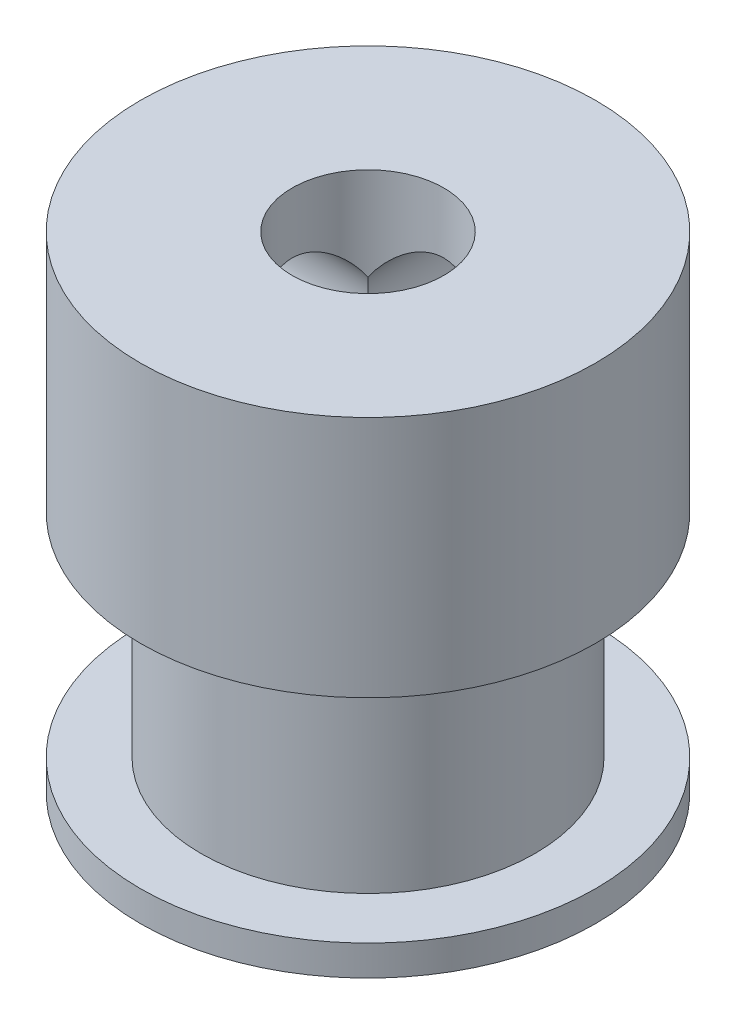
ISO-10303-21;
HEADER;
FILE_DESCRIPTION(('STEP AP214'),'2;1');
FILE_NAME('part.step','',(''),(''),'','','');
FILE_SCHEMA(('AUTOMOTIVE_DESIGN { 1 0 10303 214 1 1 1 1 }'));
ENDSEC;
DATA;
#1=APPLICATION_CONTEXT('core data for automotive mechanical design processes');
#2=APPLICATION_PROTOCOL_DEFINITION('international standard','automotive_design',2000,#1);
#3=PRODUCT_CONTEXT('',#1,'mechanical');
#4=PRODUCT('Part','Part','',(#3));
#5=PRODUCT_RELATED_PRODUCT_CATEGORY('part','',(#4));
#6=PRODUCT_DEFINITION_FORMATION('','',#4);
#7=PRODUCT_DEFINITION_CONTEXT('part definition',#1,'design');
#8=PRODUCT_DEFINITION('design','',#6,#7);
#9=PRODUCT_DEFINITION_SHAPE('','',#8);
#10=(LENGTH_UNIT() NAMED_UNIT(*) SI_UNIT(.MILLI.,.METRE.));
#11=(NAMED_UNIT(*) PLANE_ANGLE_UNIT() SI_UNIT($,.RADIAN.));
#12=(NAMED_UNIT(*) SI_UNIT($,.STERADIAN.) SOLID_ANGLE_UNIT());
#13=UNCERTAINTY_MEASURE_WITH_UNIT(LENGTH_MEASURE(1.E-05),#10,'distance_accuracy_value','');
#14=(GEOMETRIC_REPRESENTATION_CONTEXT(3) GLOBAL_UNCERTAINTY_ASSIGNED_CONTEXT((#13)) GLOBAL_UNIT_ASSIGNED_CONTEXT((#10,
#11,#12)) REPRESENTATION_CONTEXT('',''));
#15=CARTESIAN_POINT('',(0.,0.,0.));
#16=DIRECTION('',(0.,0.,1.));
#17=DIRECTION('',(1.,0.,0.));
#18=AXIS2_PLACEMENT_3D('',#15,#16,#17);
#19=CARTESIAN_POINT('',(0.,16.,0.));
#20=DIRECTION('',(0.,-1.,0.));
#21=DIRECTION('',(0.,0.,-1.));
#22=AXIS2_PLACEMENT_3D('',#19,#20,#21);
#23=CYLINDRICAL_SURFACE('',#22,7.5);
#24=CARTESIAN_POINT('',(0.,0.,0.));
#25=DIRECTION('',(0.,1.,0.));
#26=DIRECTION('',(0.,0.,1.));
#27=AXIS2_PLACEMENT_3D('',#24,#25,#26);
#28=CIRCLE('',#27,7.5);
#29=CARTESIAN_POINT('',(0.,0.,7.5));
#30=VERTEX_POINT('',#29);
#31=EDGE_CURVE('E73',#30,#30,#28,.T.);
#32=ORIENTED_EDGE('',*,*,#31,.T.);
#33=EDGE_LOOP('',(#32));
#34=FACE_BOUND('',#33,.T.);
#35=CARTESIAN_POINT('',(0.,1.,0.));
#36=DIRECTION('',(0.,-1.,0.));
#37=DIRECTION('',(0.,0.,-1.));
#38=AXIS2_PLACEMENT_3D('',#35,#36,#37);
#39=CIRCLE('',#38,7.5);
#40=CARTESIAN_POINT('',(0.,1.,-7.5));
#41=VERTEX_POINT('',#40);
#42=EDGE_CURVE('E103',#41,#41,#39,.T.);
#43=ORIENTED_EDGE('',*,*,#42,.T.);
#44=EDGE_LOOP('',(#43));
#45=FACE_BOUND('',#44,.T.);
#46=ADVANCED_FACE('F33',(#34,#45),#23,.T.);
#47=CARTESIAN_POINT('',(0.,0.,0.));
#48=DIRECTION('',(0.,1.,0.));
#49=DIRECTION('',(0.,0.,1.));
#50=AXIS2_PLACEMENT_3D('',#47,#48,#49);
#51=PLANE('',#50);
#52=CARTESIAN_POINT('',(0.,0.,0.));
#53=DIRECTION('',(0.,1.,0.));
#54=DIRECTION('',(0.,0.,1.));
#55=AXIS2_PLACEMENT_3D('',#52,#53,#54);
#56=CIRCLE('',#55,2.5);
#57=CARTESIAN_POINT('',(0.,0.,2.5));
#58=VERTEX_POINT('',#57);
#59=EDGE_CURVE('E89',#58,#58,#56,.T.);
#60=ORIENTED_EDGE('',*,*,#59,.T.);
#61=EDGE_LOOP('',(#60));
#62=FACE_BOUND('',#61,.T.);
#63=ORIENTED_EDGE('',*,*,#31,.F.);
#64=EDGE_LOOP('',(#63));
#65=FACE_BOUND('',#64,.T.);
#66=ADVANCED_FACE('F113',(#62,#65),#51,.F.);
#67=CARTESIAN_POINT('',(0.,1.,7.5));
#68=DIRECTION('',(0.,1.,0.));
#69=DIRECTION('',(0.,0.,1.));
#70=AXIS2_PLACEMENT_3D('',#67,#68,#69);
#71=PLANE('',#70);
#72=CARTESIAN_POINT('',(0.,1.,0.));
#73=DIRECTION('',(0.,-1.,0.));
#74=DIRECTION('',(0.,0.,-1.));
#75=AXIS2_PLACEMENT_3D('',#72,#73,#74);
#76=CIRCLE('',#75,5.5);
#77=CARTESIAN_POINT('',(0.,1.,-5.5));
#78=VERTEX_POINT('',#77);
#79=EDGE_CURVE('E100',#78,#78,#76,.T.);
#80=ORIENTED_EDGE('',*,*,#79,.T.);
#81=EDGE_LOOP('',(#80));
#82=FACE_BOUND('',#81,.T.);
#83=ORIENTED_EDGE('',*,*,#42,.F.);
#84=EDGE_LOOP('',(#83));
#85=FACE_BOUND('',#84,.T.);
#86=ADVANCED_FACE('F115',(#82,#85),#71,.T.);
#87=CARTESIAN_POINT('',(0.,0.,0.));
#88=DIRECTION('',(0.,-1.,0.));
#89=DIRECTION('',(0.,0.,-1.));
#90=AXIS2_PLACEMENT_3D('',#87,#88,#89);
#91=CYLINDRICAL_SURFACE('',#90,5.5);
#92=CARTESIAN_POINT('',(0.,8.,0.));
#93=DIRECTION('',(0.,-1.,0.));
#94=DIRECTION('',(0.,0.,-1.));
#95=AXIS2_PLACEMENT_3D('',#92,#93,#94);
#96=CIRCLE('',#95,5.5);
#97=CARTESIAN_POINT('',(0.,8.,-5.5));
#98=VERTEX_POINT('',#97);
#99=EDGE_CURVE('E97',#98,#98,#96,.T.);
#100=ORIENTED_EDGE('',*,*,#99,.T.);
#101=EDGE_LOOP('',(#100));
#102=FACE_BOUND('',#101,.T.);
#103=ORIENTED_EDGE('',*,*,#79,.F.);
#104=EDGE_LOOP('',(#103));
#105=FACE_BOUND('',#104,.T.);
#106=ADVANCED_FACE('F121',(#102,#105),#91,.T.);
#107=CARTESIAN_POINT('',(0.,8.,7.5));
#108=DIRECTION('',(0.,-1.,0.));
#109=DIRECTION('',(0.,0.,-1.));
#110=AXIS2_PLACEMENT_3D('',#107,#108,#109);
#111=PLANE('',#110);
#112=CARTESIAN_POINT('',(0.,8.,0.));
#113=DIRECTION('',(0.,-1.,0.));
#114=DIRECTION('',(0.,0.,-1.));
#115=AXIS2_PLACEMENT_3D('',#112,#113,#114);
#116=CIRCLE('',#115,7.5);
#117=CARTESIAN_POINT('',(0.,8.,-7.5));
#118=VERTEX_POINT('',#117);
#119=EDGE_CURVE('E92',#118,#118,#116,.T.);
#120=ORIENTED_EDGE('',*,*,#119,.T.);
#121=EDGE_LOOP('',(#120));
#122=FACE_BOUND('',#121,.T.);
#123=ORIENTED_EDGE('',*,*,#99,.F.);
#124=EDGE_LOOP('',(#123));
#125=FACE_BOUND('',#124,.T.);
#126=ADVANCED_FACE('F128',(#122,#125),#111,.T.);
#127=CARTESIAN_POINT('',(0.,16.,0.));
#128=DIRECTION('',(0.,1.,0.));
#129=DIRECTION('',(0.,0.,1.));
#130=AXIS2_PLACEMENT_3D('',#127,#128,#129);
#131=PLANE('',#130);
#132=CARTESIAN_POINT('',(0.,16.,0.));
#133=DIRECTION('',(0.,1.,0.));
#134=DIRECTION('',(0.,0.,1.));
#135=AXIS2_PLACEMENT_3D('',#132,#133,#134);
#136=CIRCLE('',#135,2.5);
#137=CARTESIAN_POINT('',(0.,16.,2.5));
#138=VERTEX_POINT('',#137);
#139=EDGE_CURVE('E63',#138,#138,#136,.T.);
#140=ORIENTED_EDGE('',*,*,#139,.F.);
#141=EDGE_LOOP('',(#140));
#142=FACE_BOUND('',#141,.T.);
#143=CARTESIAN_POINT('',(0.,16.,0.));
#144=DIRECTION('',(0.,1.,0.));
#145=DIRECTION('',(0.,0.,1.));
#146=AXIS2_PLACEMENT_3D('',#143,#144,#145);
#147=CIRCLE('',#146,7.5);
#148=CARTESIAN_POINT('',(0.,16.,7.5));
#149=VERTEX_POINT('',#148);
#150=EDGE_CURVE('E41',#149,#149,#147,.T.);
#151=ORIENTED_EDGE('',*,*,#150,.T.);
#152=EDGE_LOOP('',(#151));
#153=FACE_BOUND('',#152,.T.);
#154=ADVANCED_FACE('F126',(#142,#153),#131,.T.);
#155=CARTESIAN_POINT('',(-7.50000000000003,10.,0.));
#156=CARTESIAN_POINT('',(-7.49999833810164,10.0000026169349,-0.110254555832828));
#157=CARTESIAN_POINT('',(-7.49754486162152,10.0091476141897,-0.220537160221813));
#158=CARTESIAN_POINT('',(-7.48799573621659,10.0454212307387,-0.437925451354436));
#159=CARTESIAN_POINT('',(-7.48089785332586,10.0725585044261,-0.545029583319059));
#160=CARTESIAN_POINT('',(-7.46284333252791,10.143871666864,-0.752891589045285));
#161=CARTESIAN_POINT('',(-7.45189167130376,10.188025587666,-0.853657451015257));
#162=CARTESIAN_POINT('',(-7.42728699151678,10.2920372426666,-1.04635368639263));
#163=CARTESIAN_POINT('',(-7.4136337929518,10.3518960233593,-1.1382834704496));
#164=CARTESIAN_POINT('',(-7.38474614901995,10.4870835164134,-1.31282950373999));
#165=CARTESIAN_POINT('',(-7.36948467678682,10.5627086680083,-1.39521168986276));
#166=CARTESIAN_POINT('',(-7.33927409679592,10.7266484830634,-1.54628713660635));
#167=CARTESIAN_POINT('',(-7.32432502947244,10.8149647776175,-1.61497863495662));
#168=CARTESIAN_POINT('',(-7.29615537464373,11.0036482348254,-1.73786409243412));
#169=CARTESIAN_POINT('',(-7.28296888563239,11.1041963282617,-1.79178877736485));
#170=CARTESIAN_POINT('',(-7.26021477318188,11.3133401110924,-1.88187548076991));
#171=CARTESIAN_POINT('',(-7.25064648253265,11.4219343123314,-1.91804077451366));
#172=CARTESIAN_POINT('',(-7.236491158024,11.641495537825,-1.97076920226501));
#173=CARTESIAN_POINT('',(-7.23179647811491,11.7523535399307,-1.98775670244689));
#174=CARTESIAN_POINT('',(-7.22759830916371,11.9754376833065,-2.00297034705817));
#175=CARTESIAN_POINT('',(-7.22809385014446,12.0876635650241,-2.00119999705751));
#176=CARTESIAN_POINT('',(-7.23412378802031,12.3069854153741,-1.97928510002697));
#177=CARTESIAN_POINT('',(-7.23951735511532,12.4141371820385,-1.95965406064762));
#178=CARTESIAN_POINT('',(-7.25451013080689,12.6235683344562,-1.9033974872218));
#179=CARTESIAN_POINT('',(-7.26410967552613,12.7258473300753,-1.86677059492992));
#180=CARTESIAN_POINT('',(-7.28655661748387,12.9239681438086,-1.77714356965253));
#181=CARTESIAN_POINT('',(-7.29943942818704,13.0197243392863,-1.72396341137782));
#182=CARTESIAN_POINT('',(-7.32698229642445,13.2011341588515,-1.60286503823775));
#183=CARTESIAN_POINT('',(-7.34164270355187,13.2867857891565,-1.53494392224249));
#184=CARTESIAN_POINT('',(-7.37167510629864,13.4484889974548,-1.38366607263417));
#185=CARTESIAN_POINT('',(-7.38705471488831,13.5241363183149,-1.29987812728297));
#186=CARTESIAN_POINT('',(-7.41636381276316,13.6603887803503,-1.12061766820635));
#187=CARTESIAN_POINT('',(-7.43029324488555,13.7209933287024,-1.02514469420507));
#188=CARTESIAN_POINT('',(-7.45521820398294,13.8256179028246,-0.824598255497428));
#189=CARTESIAN_POINT('',(-7.4662007283356,13.8695647704486,-0.719484902551765));
#190=CARTESIAN_POINT('',(-7.48390044401,13.9390471888134,-0.503002294390372));
#191=CARTESIAN_POINT('',(-7.49061856733749,13.964586762724,-0.3916344119283));
#192=CARTESIAN_POINT('',(-7.49889158558384,13.9958948769178,-0.169254083145492));
#193=CARTESIAN_POINT('',(-7.50058997470959,14.0022130398509,-0.0583242376413571));
#194=CARTESIAN_POINT('',(-7.49904471691695,13.9964168357531,0.163010045901222));
#195=CARTESIAN_POINT('',(-7.49580158080353,13.9843043738942,0.273414537062138));
#196=CARTESIAN_POINT('',(-7.48483035496021,13.94244155254,0.488602449901804));
#197=CARTESIAN_POINT('',(-7.47718026546329,13.9129977538022,0.593449852027806));
#198=CARTESIAN_POINT('',(-7.45826294894139,13.8376640554921,0.796706971176088));
#199=CARTESIAN_POINT('',(-7.44699532996161,13.7917723737495,0.895115989216051));
#200=CARTESIAN_POINT('',(-7.42175660559528,13.6838261128195,1.08483847466798));
#201=CARTESIAN_POINT('',(-7.40773686604956,13.6214725332023,1.17597518846121));
#202=CARTESIAN_POINT('',(-7.37861452365563,13.482748369842,1.34668463539717));
#203=CARTESIAN_POINT('',(-7.3635117072752,13.4063750173989,1.4262550787992));
#204=CARTESIAN_POINT('',(-7.33339745866704,13.2392144225054,1.57388924478776));
#205=CARTESIAN_POINT('',(-7.31840061429312,13.1480814386048,1.64156519249818));
#206=CARTESIAN_POINT('',(-7.29066447182727,12.9554353039004,1.76067191185121));
#207=CARTESIAN_POINT('',(-7.27792507956316,12.8539225863777,1.81210336122163));
#208=CARTESIAN_POINT('',(-7.25629268373209,12.6439046929239,1.89687411586115));
#209=CARTESIAN_POINT('',(-7.24737748318008,12.5354441881824,1.9303181225396));
#210=CARTESIAN_POINT('',(-7.234398251268,12.3141606803253,1.97841205118793));
#211=CARTESIAN_POINT('',(-7.23033298020014,12.2013387996521,1.9930667760248));
#212=CARTESIAN_POINT('',(-7.22761744573588,11.9785052121162,2.00288989653717));
#213=CARTESIAN_POINT('',(-7.22879397743238,11.8685226797417,1.99868155618111));
#214=CARTESIAN_POINT('',(-7.23602396081087,11.65089648599,1.97234376000441));
#215=CARTESIAN_POINT('',(-7.24207728699438,11.5432527644994,1.95021476535028));
#216=CARTESIAN_POINT('',(-7.25827571073158,11.3341442478702,1.88902515699702));
#217=CARTESIAN_POINT('',(-7.26838885019644,11.2326381572678,1.85009661075583));
#218=CARTESIAN_POINT('',(-7.29156818136177,11.0375211694659,1.75651554562389));
#219=CARTESIAN_POINT('',(-7.30463483621363,10.9439115136995,1.70186056024619));
#220=CARTESIAN_POINT('',(-7.3327292144046,10.7642696405034,1.57648909268819));
#221=CARTESIAN_POINT('',(-7.3478033310169,10.6785414650238,1.50534729767912));
#222=CARTESIAN_POINT('',(-7.37795503783007,10.5200375483327,1.34983053511103));
#223=CARTESIAN_POINT('',(-7.3930326279844,10.4472649613312,1.26545235435877));
#224=CARTESIAN_POINT('',(-7.42187812403968,10.3152077623531,1.08367998108871));
#225=CARTESIAN_POINT('',(-7.4356111131455,10.2562449893507,0.986045961751808));
#226=CARTESIAN_POINT('',(-7.45983810102897,10.1556625840706,0.781888640416917));
#227=CARTESIAN_POINT('',(-7.47033417683594,10.1140318243364,0.675371094696325));
#228=CARTESIAN_POINT('',(-7.48554752513467,10.0547247145845,0.474374704881018));
#229=CARTESIAN_POINT('',(-7.49092770592601,10.0342506164075,0.380762016565062));
#230=CARTESIAN_POINT('',(-7.49815449036457,10.0068877938329,0.191439795317102));
#231=CARTESIAN_POINT('',(-7.50000144297273,9.99999772779998,0.0957304704048863));
#232=CARTESIAN_POINT('',(-7.50000000000003,10.,0.));
#233=B_SPLINE_CURVE_WITH_KNOTS('',3,(#155,#156,#157,#158,#159,#160,#161,#162,#163,#164,#165,
#166,#167,#168,#169,#170,#171,#172,#173,#174,#175,#176,#177,#178,#179,#180,#181,#182,#183,#184,
#185,#186,#187,#188,#189,#190,#191,#192,#193,#194,#195,#196,#197,#198,#199,#200,#201,#202,#203,
#204,#205,#206,#207,#208,#209,#210,#211,#212,#213,#214,#215,#216,#217,#218,#219,#220,#221,#222,
#223,#224,#225,#226,#227,#228,#229,#230,#231,#232),.UNSPECIFIED.,.T.,.F.,(4,2,2,2,2,2,2,2,2,2,2,
2,2,2,2,2,2,2,2,2,2,2,2,2,2,2,2,2,2,2,2,2,2,2,2,2,2,2,4),(0.,0.330412598949568,
0.660984243761449,0.991130552971931,1.32129886708675,1.65834897954967,1.99544244925149,
2.33832582523229,2.68114594129699,3.01622158250468,3.35123460404319,3.67691002045997,
4.0026114681294,4.33198673346498,4.6614268811763,5.00161259812322,5.34181171937597,
5.68348809603041,6.02508977190138,6.35682717524547,6.6885302892535,7.01453535642116,
7.34057575775614,7.6730028600455,8.00549568258887,8.34736496382788,8.68921998024107,
9.02906297699386,9.36881908663983,9.69743342403611,10.0260393052059,10.352107654483,
10.67822717123,11.0139433957139,11.3497412433245,11.692722522809,12.0354832614518,
12.3223981899334,12.6092847796638),.UNSPECIFIED.);
#234=CARTESIAN_POINT('',(-7.50000000000003,10.,0.));
#235=VERTEX_POINT('',#234);
#236=EDGE_CURVE('E57',#235,#235,#233,.T.);
#237=ORIENTED_EDGE('',*,*,#236,.T.);
#238=EDGE_LOOP('',(#237));
#239=FACE_BOUND('',#238,.T.);
#240=CARTESIAN_POINT('',(0.,14.,-7.5));
#241=CARTESIAN_POINT('',(-0.110254555832854,13.9999973830651,-7.49999833810162));
#242=CARTESIAN_POINT('',(-0.22053716022184,13.9908523858103,-7.49754486162151));
#243=CARTESIAN_POINT('',(-0.437925451354463,13.9545787692613,-7.4879957362166));
#244=CARTESIAN_POINT('',(-0.545029583319086,13.9274414955739,-7.48089785332586));
#245=CARTESIAN_POINT('',(-0.752891589045312,13.856128333136,-7.46284333252791));
#246=CARTESIAN_POINT('',(-0.853657451015285,13.811974412334,-7.45189167130375));
#247=CARTESIAN_POINT('',(-1.04635368639266,13.7079627573334,-7.42728699151678));
#248=CARTESIAN_POINT('',(-1.13828347044963,13.6481039766407,-7.4136337929518));
#249=CARTESIAN_POINT('',(-1.31282950374002,13.5129164835866,-7.38474614901995));
#250=CARTESIAN_POINT('',(-1.39521168986279,13.4372913319917,-7.36948467678681));
#251=CARTESIAN_POINT('',(-1.54628713660638,13.2733515169366,-7.33927409679591));
#252=CARTESIAN_POINT('',(-1.61497863495664,13.1850352223825,-7.32432502947243));
#253=CARTESIAN_POINT('',(-1.73786409243415,12.9963517651746,-7.29615537464372));
#254=CARTESIAN_POINT('',(-1.79178877736487,12.8958036717383,-7.28296888563239));
#255=CARTESIAN_POINT('',(-1.88187548076994,12.6866598889076,-7.26021477318187));
#256=CARTESIAN_POINT('',(-1.91804077451369,12.5780656876686,-7.25064648253265));
#257=CARTESIAN_POINT('',(-1.97076920226504,12.358504462175,-7.23649115802399));
#258=CARTESIAN_POINT('',(-1.98775670244692,12.2476464600693,-7.2317964781149));
#259=CARTESIAN_POINT('',(-2.0029703470582,12.0245623166935,-7.22759830916371));
#260=CARTESIAN_POINT('',(-2.00119999705753,11.9123364349759,-7.22809385014446));
#261=CARTESIAN_POINT('',(-1.97928510002699,11.6930145846259,-7.23412378802031));
#262=CARTESIAN_POINT('',(-1.95965406064765,11.5858628179615,-7.23951735511531));
#263=CARTESIAN_POINT('',(-1.90339748722183,11.3764316655438,-7.25451013080688));
#264=CARTESIAN_POINT('',(-1.86677059492995,11.2741526699247,-7.26410967552613));
#265=CARTESIAN_POINT('',(-1.77714356965256,11.0760318561914,-7.28655661748386));
#266=CARTESIAN_POINT('',(-1.72396341137784,10.9802756607137,-7.29943942818703));
#267=CARTESIAN_POINT('',(-1.60286503823777,10.7988658411485,-7.32698229642445));
#268=CARTESIAN_POINT('',(-1.53494392224251,10.7132142108435,-7.34164270355186));
#269=CARTESIAN_POINT('',(-1.38366607263419,10.5515110025452,-7.37167510629864));
#270=CARTESIAN_POINT('',(-1.29987812728299,10.475863681685,-7.38705471488831));
#271=CARTESIAN_POINT('',(-1.12061766820637,10.3396112196497,-7.41636381276316));
#272=CARTESIAN_POINT('',(-1.02514469420509,10.2790066712976,-7.43029324488555));
#273=CARTESIAN_POINT('',(-0.824598255497451,10.1743820971754,-7.45521820398293));
#274=CARTESIAN_POINT('',(-0.719484902551789,10.1304352295514,-7.4662007283356));
#275=CARTESIAN_POINT('',(-0.503002294390395,10.0609528111866,-7.48390044400999));
#276=CARTESIAN_POINT('',(-0.391634411928323,10.035413237276,-7.49061856733749));
#277=CARTESIAN_POINT('',(-0.169254083145515,10.0041051230822,-7.49889158558384));
#278=CARTESIAN_POINT('',(-0.0583242376413801,9.99778696014913,-7.50058997470959));
#279=CARTESIAN_POINT('',(0.163010045901199,10.0035831642469,-7.49904471691695));
#280=CARTESIAN_POINT('',(0.273414537062114,10.0156956261058,-7.49580158080353));
#281=CARTESIAN_POINT('',(0.48860244990178,10.05755844746,-7.48483035496021));
#282=CARTESIAN_POINT('',(0.593449852027783,10.0870022461978,-7.4771802654633));
#283=CARTESIAN_POINT('',(0.796706971176065,10.1623359445079,-7.45826294894139));
#284=CARTESIAN_POINT('',(0.895115989216027,10.2082276262505,-7.44699532996161));
#285=CARTESIAN_POINT('',(1.08483847466795,10.3161738871805,-7.42175660559529));
#286=CARTESIAN_POINT('',(1.17597518846118,10.3785274667977,-7.40773686604957));
#287=CARTESIAN_POINT('',(1.34668463539715,10.517251630158,-7.37861452365564));
#288=CARTESIAN_POINT('',(1.42625507879918,10.5936249826011,-7.3635117072752));
#289=CARTESIAN_POINT('',(1.57388924478774,10.7607855774946,-7.33339745866705));
#290=CARTESIAN_POINT('',(1.64156519249816,10.8519185613952,-7.31840061429312));
#291=CARTESIAN_POINT('',(1.76067191185118,11.0445646960996,-7.29066447182728));
#292=CARTESIAN_POINT('',(1.81210336122161,11.1460774136223,-7.27792507956316));
#293=CARTESIAN_POINT('',(1.89687411586112,11.3560953070761,-7.2562926837321));
#294=CARTESIAN_POINT('',(1.93031812253958,11.4645558118176,-7.24737748318009));
#295=CARTESIAN_POINT('',(1.97841205118791,11.6858393196748,-7.23439825126801));
#296=CARTESIAN_POINT('',(1.99306677602478,11.7986612003479,-7.23033298020014));
#297=CARTESIAN_POINT('',(2.00288989653714,12.0214947878838,-7.22761744573589));
#298=CARTESIAN_POINT('',(1.99868155618109,12.1314773202583,-7.22879397743239));
#299=CARTESIAN_POINT('',(1.97234376000439,12.34910351401,-7.23602396081087));
#300=CARTESIAN_POINT('',(1.95021476535025,12.4567472355006,-7.24207728699439));
#301=CARTESIAN_POINT('',(1.88902515699699,12.6658557521298,-7.25827571073158));
#302=CARTESIAN_POINT('',(1.8500966107558,12.7673618427322,-7.26838885019644));
#303=CARTESIAN_POINT('',(1.75651554562386,12.9624788305341,-7.29156818136178));
#304=CARTESIAN_POINT('',(1.70186056024617,13.0560884863005,-7.30463483621364));
#305=CARTESIAN_POINT('',(1.57648909268817,13.2357303594966,-7.3327292144046));
#306=CARTESIAN_POINT('',(1.50534729767909,13.3214585349762,-7.3478033310169));
#307=CARTESIAN_POINT('',(1.349830535111,13.4799624516673,-7.37795503783008));
#308=CARTESIAN_POINT('',(1.26545235435875,13.5527350386688,-7.39303262798441));
#309=CARTESIAN_POINT('',(1.08367998108868,13.6847922376469,-7.42187812403969));
#310=CARTESIAN_POINT('',(0.986045961751779,13.7437550106493,-7.43561111314551));
#311=CARTESIAN_POINT('',(0.781888640416889,13.8443374159294,-7.45983810102898));
#312=CARTESIAN_POINT('',(0.675371094696296,13.8859681756636,-7.47033417683594));
#313=CARTESIAN_POINT('',(0.47437470488099,13.9452752854155,-7.48554752513468));
#314=CARTESIAN_POINT('',(0.380762016565036,13.9657493835925,-7.49092770592602));
#315=CARTESIAN_POINT('',(0.191439795317076,13.9931122061671,-7.49815449036456));
#316=CARTESIAN_POINT('',(0.0957304704048603,14.0000022722,-7.5000014429727));
#317=CARTESIAN_POINT('',(0.,14.,-7.5));
#318=B_SPLINE_CURVE_WITH_KNOTS('',3,(#240,#241,#242,#243,#244,#245,#246,#247,#248,#249,#250,
#251,#252,#253,#254,#255,#256,#257,#258,#259,#260,#261,#262,#263,#264,#265,#266,#267,#268,#269,
#270,#271,#272,#273,#274,#275,#276,#277,#278,#279,#280,#281,#282,#283,#284,#285,#286,#287,#288,
#289,#290,#291,#292,#293,#294,#295,#296,#297,#298,#299,#300,#301,#302,#303,#304,#305,#306,#307,
#308,#309,#310,#311,#312,#313,#314,#315,#316,#317),.UNSPECIFIED.,.T.,.F.,(4,2,2,2,2,2,2,2,2,2,2,
2,2,2,2,2,2,2,2,2,2,2,2,2,2,2,2,2,2,2,2,2,2,2,2,2,2,2,4),(0.,0.330412598949569,0.66098424376145,
0.991130552971932,1.32129886708675,1.65834897954967,1.99544244925149,2.33832582523229,
2.681145941297,3.01622158250468,3.3512346040432,3.67691002045997,4.0026114681294,
4.33198673346498,4.6614268811763,5.00161259812322,5.34181171937597,5.68348809603041,
6.02508977190139,6.35682717524547,6.68853028925351,7.01453535642116,7.34057575775614,
7.6730028600455,8.00549568258887,8.34736496382789,8.68921998024107,9.02906297699387,
9.36881908663983,9.69743342403611,10.0260393052059,10.352107654483,10.67822717123,
11.0139433957139,11.3497412433245,11.692722522809,12.0354832614518,12.3223981899334,
12.6092847796638),.UNSPECIFIED.);
#319=CARTESIAN_POINT('',(0.,14.,-7.5));
#320=VERTEX_POINT('',#319);
#321=EDGE_CURVE('E61',#320,#320,#318,.T.);
#322=ORIENTED_EDGE('',*,*,#321,.T.);
#323=EDGE_LOOP('',(#322));
#324=FACE_BOUND('',#323,.T.);
#325=ORIENTED_EDGE('',*,*,#150,.F.);
#326=EDGE_LOOP('',(#325));
#327=FACE_BOUND('',#326,.T.);
#328=ORIENTED_EDGE('',*,*,#119,.F.);
#329=EDGE_LOOP('',(#328));
#330=FACE_BOUND('',#329,.T.);
#331=ADVANCED_FACE('F124',(#239,#324,#327,#330),#23,.T.);
#332=CARTESIAN_POINT('',(0.,0.,0.));
#333=DIRECTION('',(0.,1.,0.));
#334=DIRECTION('',(0.,0.,1.));
#335=AXIS2_PLACEMENT_3D('',#332,#333,#334);
#336=CYLINDRICAL_SURFACE('',#335,2.5);
#337=CARTESIAN_POINT('',(2.,12.,-1.5));
#338=CARTESIAN_POINT('',(1.9999899563842,11.9249189826114,-1.5000227575991));
#339=CARTESIAN_POINT('',(1.99572243014959,11.8497210739064,-1.50575588676017));
#340=CARTESIAN_POINT('',(1.97904350434638,11.7016854705704,-1.52759797098302));
#341=CARTESIAN_POINT('',(1.96660415938922,11.6288567781879,-1.54374252679463));
#342=CARTESIAN_POINT('',(1.9288828901246,11.4623945804914,-1.59078313764401));
#343=CARTESIAN_POINT('',(1.90063587852784,11.3703574929004,-1.62485949442395));
#344=CARTESIAN_POINT('',(1.83286412912234,11.1940318598387,-1.70094533012843));
#345=CARTESIAN_POINT('',(1.79330760683741,11.1097660503329,-1.74297705283046));
#346=CARTESIAN_POINT('',(1.68777756612173,10.9196603432195,-1.84624966659378));
#347=CARTESIAN_POINT('',(1.6174236371176,10.8170334258727,-1.90894188114929));
#348=CARTESIAN_POINT('',(1.45861935064739,10.6260231647878,-2.03287996747903));
#349=CARTESIAN_POINT('',(1.37018407682201,10.5376280578861,-2.0941269976447));
#350=CARTESIAN_POINT('',(1.19476026278806,10.3928950804225,-2.1979067439451));
#351=CARTESIAN_POINT('',(1.11093376146689,10.3336737173159,-2.24174680788007));
#352=CARTESIAN_POINT('',(0.932444755507561,10.2276340400337,-2.32165152523267));
#353=CARTESIAN_POINT('',(0.837799422094948,10.1807964517991,-2.35772824500368));
#354=CARTESIAN_POINT('',(0.655317082222546,10.1082870394193,-2.41415644696378));
#355=CARTESIAN_POINT('',(0.568853585755693,10.0804174354239,-2.43610736091393));
#356=CARTESIAN_POINT('',(0.391188052921989,10.036501304746,-2.47085912284979));
#357=CARTESIAN_POINT('',(0.29998863731262,10.02044831209,-2.48366497483986));
#358=CARTESIAN_POINT('',(0.115048335136525,10.0011419067099,-2.49907968883617));
#359=CARTESIAN_POINT('',(0.0212997713726984,9.99793280731136,-2.50165324772141));
#360=CARTESIAN_POINT('',(-0.165416366428143,10.0046642348722,-2.49626936144757));
#361=CARTESIAN_POINT('',(-0.258383904122235,10.0146053703685,-2.48831142893578));
#362=CARTESIAN_POINT('',(-0.4356835684361,10.046067986313,-2.4632836571348));
#363=CARTESIAN_POINT('',(-0.520210188917501,10.0669288169561,-2.44673404857181));
#364=CARTESIAN_POINT('',(-0.684171862172428,10.1186952342522,-2.40604493660584));
#365=CARTESIAN_POINT('',(-0.763605624129772,10.1496033554976,-2.38190351809567));
#366=CARTESIAN_POINT('',(-0.923527318234434,10.2236006985885,-2.32486221996811));
#367=CARTESIAN_POINT('',(-1.00337969293305,10.2675765160147,-2.29134265660255));
#368=CARTESIAN_POINT('',(-1.15470891362336,10.3645378595917,-2.21894043646479));
#369=CARTESIAN_POINT('',(-1.22618103296473,10.4175284293631,-2.18005477975511));
#370=CARTESIAN_POINT('',(-1.37426521356107,10.5430618687988,-2.09053510980241));
#371=CARTESIAN_POINT('',(-1.44890108738507,10.6173836142049,-2.03913144290366));
#372=CARTESIAN_POINT('',(-1.58538384993671,10.7762559036507,-1.9349237792571));
#373=CARTESIAN_POINT('',(-1.6472149443604,10.8608188786743,-1.88211814269102));
#374=CARTESIAN_POINT('',(-1.75228528490804,11.0312201958179,-1.78441317626436));
#375=CARTESIAN_POINT('',(-1.79674173995946,11.1161509405137,-1.73924224553799));
#376=CARTESIAN_POINT('',(-1.87389106987978,11.2943664663345,-1.65582105773209));
#377=CARTESIAN_POINT('',(-1.90660965872838,11.3876324203376,-1.61755576516689));
#378=CARTESIAN_POINT('',(-1.95062199735974,11.5527916040278,-1.56393805143324));
#379=CARTESIAN_POINT('',(-1.96540293714784,11.6226128308979,-1.54515601955456));
#380=CARTESIAN_POINT('',(-1.98746978122375,11.7651802059541,-1.51667304681101));
#381=CARTESIAN_POINT('',(-1.99477239579985,11.8379194539107,-1.50695186390373));
#382=CARTESIAN_POINT('',(-2.0012999442642,11.9848633779274,-1.49827790293909));
#383=CARTESIAN_POINT('',(-2.00047806264257,12.0590740850574,-1.49938753445573));
#384=CARTESIAN_POINT('',(-1.99072610261057,12.2060473250374,-1.51230456185753));
#385=CARTESIAN_POINT('',(-1.98178458332098,12.2788076663875,-1.52412705251965));
#386=CARTESIAN_POINT('',(-1.95331430449203,12.4390632026618,-1.56051508430773));
#387=CARTESIAN_POINT('',(-1.9316709289088,12.5255982681308,-1.58755721486228));
#388=CARTESIAN_POINT('',(-1.87841388450525,12.6922908660855,-1.65022809339808));
#389=CARTESIAN_POINT('',(-1.84677049067316,12.7724284809031,-1.6858823654909));
#390=CARTESIAN_POINT('',(-1.75807608919816,12.9615289293493,-1.77903249993889));
#391=CARTESIAN_POINT('',(-1.69602510944931,13.0668953343252,-1.83905564347524));
#392=CARTESIAN_POINT('',(-1.55438039564657,13.264384149242,-1.96026853157684));
#393=CARTESIAN_POINT('',(-1.47476601547361,13.3564907596835,-2.0214595710443));
#394=CARTESIAN_POINT('',(-1.29702304107541,13.527462807345,-2.13993299259158));
#395=CARTESIAN_POINT('',(-1.19864860522963,13.6061226291131,-2.19714788259661));
#396=CARTESIAN_POINT('',(-0.984970277741316,13.7452665274442,-2.30083046289375));
#397=CARTESIAN_POINT('',(-0.869723203455188,13.8058096056706,-2.34733292440641));
#398=CARTESIAN_POINT('',(-0.66453199414097,13.8884905874669,-2.41163161860483));
#399=CARTESIAN_POINT('',(-0.578408265123332,13.9167173769741,-2.43384921549886));
#400=CARTESIAN_POINT('',(-0.401365381235629,13.961432134964,-2.46921550391513));
#401=CARTESIAN_POINT('',(-0.310449944179056,13.9779290645406,-2.48237111815073));
#402=CARTESIAN_POINT('',(-0.1259613580523,13.9981928241047,-2.49854699723995));
#403=CARTESIAN_POINT('',(-0.0323797561454452,14.0019132050583,-2.50153028039159));
#404=CARTESIAN_POINT('',(0.154129494971558,13.9962334907348,-2.4969871999336));
#405=CARTESIAN_POINT('',(0.247057097671193,13.9868324715917,-2.48946009629711));
#406=CARTESIAN_POINT('',(0.42448498330785,13.9563964529088,-2.46524008405095));
#407=CARTESIAN_POINT('',(0.509170159101621,13.9360106685972,-2.449059003061));
#408=CARTESIAN_POINT('',(0.673520542356751,13.8851465786865,-2.4090520196301));
#409=CARTESIAN_POINT('',(0.753184443303532,13.854665659174,-2.38522413726749));
#410=CARTESIAN_POINT('',(0.913383591851874,13.7816254556074,-2.32886203207213));
#411=CARTESIAN_POINT('',(0.993310088153979,13.738206157889,-2.29572397002091));
#412=CARTESIAN_POINT('',(1.14486396126306,13.6423576629054,-2.22403396009592));
#413=CARTESIAN_POINT('',(1.21648689776309,13.5899236819315,-2.18547913977515));
#414=CARTESIAN_POINT('',(1.36488223995398,13.4657037869963,-2.09666852429869));
#415=CARTESIAN_POINT('',(1.43970803793641,13.3921535866846,-2.04563299169992));
#416=CARTESIAN_POINT('',(1.57669353079991,13.2348830744766,-1.94201312920059));
#417=CARTESIAN_POINT('',(1.63883728583054,13.1511501723947,-1.88942694411833));
#418=CARTESIAN_POINT('',(1.74551261366341,12.9810424554704,-1.7910912532181));
#419=CARTESIAN_POINT('',(1.79106140064659,12.8954274787839,-1.74513263017547));
#420=CARTESIAN_POINT('',(1.87016304685231,12.7156081117486,-1.66007449903138));
#421=CARTESIAN_POINT('',(1.90373836359645,12.6214202219623,-1.6209622208173));
#422=CARTESIAN_POINT('',(1.94914139922438,12.4538606732473,-1.56580101941138));
#423=CARTESIAN_POINT('',(1.96446470848963,12.3825804555928,-1.54635220628733));
#424=CARTESIAN_POINT('',(1.98726282623961,12.2369757290291,-1.51695472225641));
#425=CARTESIAN_POINT('',(1.99476751139893,12.1626639447221,-1.50696990066825));
#426=CARTESIAN_POINT('',(1.99935742227831,12.0586747856577,-1.50085460132402));
#427=CARTESIAN_POINT('',(2.00000392566845,12.0293463217565,-1.49999110491774));
#428=CARTESIAN_POINT('',(2.,12.,-1.5));
#429=B_SPLINE_CURVE_WITH_KNOTS('',3,(#337,#338,#339,#340,#341,#342,#343,#344,#345,#346,#347,
#348,#349,#350,#351,#352,#353,#354,#355,#356,#357,#358,#359,#360,#361,#362,#363,#364,#365,#366,
#367,#368,#369,#370,#371,#372,#373,#374,#375,#376,#377,#378,#379,#380,#381,#382,#383,#384,#385,
#386,#387,#388,#389,#390,#391,#392,#393,#394,#395,#396,#397,#398,#399,#400,#401,#402,#403,#404,
#405,#406,#407,#408,#409,#410,#411,#412,#413,#414,#415,#416,#417,#418,#419,#420,#421,#422,#423,
#424,#425,#426,#427,#428),.UNSPECIFIED.,.T.,.F.,(4,2,2,2,2,2,2,2,2,2,2,2,2,2,2,2,2,2,2,2,2,2,2,
2,2,2,2,2,2,2,2,2,2,2,2,2,2,2,2,2,2,2,2,2,2,4),(0.,0.225140818813293,0.451055593895018,
0.755714384660881,1.06123795594964,1.47720804611674,1.8928325353688,2.22639303179098,
2.55943127851025,2.83862094435178,3.11765772560939,3.39765639927928,3.67766803055209,
3.94241917501297,4.20723715914625,4.49756510688428,4.78805602626152,5.13841226546405,
5.48919811771067,5.80619193384967,6.12248701337037,6.34307726284838,6.56317352160417,
6.78453876949456,7.00621641426759,7.28428560377195,7.56318925297414,7.96975811975668,
8.37680748728572,8.78961174948154,9.20105660259845,9.47985927613152,9.75844872724253,
10.0380499218877,10.3176708039936,10.5823344198312,10.8470666181456,11.1364335884202,
11.4259545900794,11.7747351905783,12.1239515037794,12.4449574092071,12.7653580273015,
12.9909138326702,13.2156045429056,13.3036035490356),.UNSPECIFIED.);
#430=CARTESIAN_POINT('',(-1.76776695296637,12.9354143466935,-1.76776695296637));
#431=VERTEX_POINT('',#430);
#432=CARTESIAN_POINT('',(-1.76776695296895,11.0645856533037,-1.76776695296395));
#433=VERTEX_POINT('',#432);
#434=EDGE_CURVE('E56',#431,#433,#429,.T.);
#435=ORIENTED_EDGE('',*,*,#434,.T.);
#436=CARTESIAN_POINT('',(-1.50000000000001,12.,-1.99999999999999));
#437=CARTESIAN_POINT('',(-1.50002275759911,11.9249189826114,-1.99998995638419));
#438=CARTESIAN_POINT('',(-1.50575588676017,11.8497210739064,-1.99572243014958));
#439=CARTESIAN_POINT('',(-1.52759797098302,11.7016854705704,-1.97904350434638));
#440=CARTESIAN_POINT('',(-1.54374252679464,11.6288567781879,-1.96660415938922));
#441=CARTESIAN_POINT('',(-1.59078313764402,11.4623945804914,-1.92888289012459));
#442=CARTESIAN_POINT('',(-1.62485949442395,11.3703574929005,-1.90063587852783));
#443=CARTESIAN_POINT('',(-1.70094533012843,11.1940318598387,-1.83286412912234));
#444=CARTESIAN_POINT('',(-1.74297705283046,11.1097660503329,-1.7933076068374));
#445=CARTESIAN_POINT('',(-1.84624966659379,10.9196603432195,-1.68777756612172));
#446=CARTESIAN_POINT('',(-1.9089418811493,10.8170334258727,-1.6174236371176));
#447=CARTESIAN_POINT('',(-2.03287996747903,10.6260231647878,-1.45861935064739));
#448=CARTESIAN_POINT('',(-2.09412699764471,10.5376280578861,-1.370184076822));
#449=CARTESIAN_POINT('',(-2.19790674394511,10.3928950804225,-1.19476026278806));
#450=CARTESIAN_POINT('',(-2.24174680788008,10.3336737173159,-1.11093376146688));
#451=CARTESIAN_POINT('',(-2.32165152523268,10.2276340400337,-0.932444755507556));
#452=CARTESIAN_POINT('',(-2.35772824500368,10.1807964517991,-0.837799422094943));
#453=CARTESIAN_POINT('',(-2.41415644696378,10.1082870394193,-0.655317082222541));
#454=CARTESIAN_POINT('',(-2.43610736091393,10.0804174354239,-0.568853585755687));
#455=CARTESIAN_POINT('',(-2.47085912284979,10.036501304746,-0.391188052921983));
#456=CARTESIAN_POINT('',(-2.48366497483986,10.02044831209,-0.299988637312615));
#457=CARTESIAN_POINT('',(-2.49907968883617,10.0011419067099,-0.115048335136519));
#458=CARTESIAN_POINT('',(-2.50165324772141,9.99793280731136,-0.021299771372693));
#459=CARTESIAN_POINT('',(-2.49626936144757,10.0046642348722,0.165416366428149));
#460=CARTESIAN_POINT('',(-2.48831142893578,10.0146053703685,0.258383904122241));
#461=CARTESIAN_POINT('',(-2.4632836571348,10.046067986313,0.435683568436106));
#462=CARTESIAN_POINT('',(-2.44673404857181,10.0669288169561,0.520210188917507));
#463=CARTESIAN_POINT('',(-2.40604493660583,10.1186952342522,0.684171862172434));
#464=CARTESIAN_POINT('',(-2.38190351809567,10.1496033554976,0.763605624129777));
#465=CARTESIAN_POINT('',(-2.32486221996811,10.2236006985885,0.92352731823444));
#466=CARTESIAN_POINT('',(-2.29134265660255,10.2675765160147,1.00337969293306));
#467=CARTESIAN_POINT('',(-2.21894043646479,10.3645378595917,1.15470891362337));
#468=CARTESIAN_POINT('',(-2.18005477975511,10.4175284293631,1.22618103296473));
#469=CARTESIAN_POINT('',(-2.0905351098024,10.5430618687988,1.37426521356107));
#470=CARTESIAN_POINT('',(-2.03913144290366,10.6173836142049,1.44890108738508));
#471=CARTESIAN_POINT('',(-1.9349237792571,10.7762559036507,1.58538384993672));
#472=CARTESIAN_POINT('',(-1.88211814269101,10.8608188786743,1.64721494436041));
#473=CARTESIAN_POINT('',(-1.78441317626436,11.0312201958179,1.75228528490805));
#474=CARTESIAN_POINT('',(-1.73924224553799,11.1161509405137,1.79674173995946));
#475=CARTESIAN_POINT('',(-1.65582105773208,11.2943664663345,1.87389106987979));
#476=CARTESIAN_POINT('',(-1.61755576516689,11.3876324203376,1.90660965872838));
#477=CARTESIAN_POINT('',(-1.56393805143323,11.5527916040277,1.95062199735975));
#478=CARTESIAN_POINT('',(-1.54515601955456,11.6226128308979,1.96540293714784));
#479=CARTESIAN_POINT('',(-1.516673046811,11.7651802059541,1.98746978122376));
#480=CARTESIAN_POINT('',(-1.50695186390373,11.8379194539107,1.99477239579985));
#481=CARTESIAN_POINT('',(-1.49827790293909,11.9848633779274,2.00129994426421));
#482=CARTESIAN_POINT('',(-1.49938753445572,12.0590740850574,2.00047806264258));
#483=CARTESIAN_POINT('',(-1.51230456185752,12.2060473250374,1.99072610261058));
#484=CARTESIAN_POINT('',(-1.52412705251964,12.2788076663875,1.98178458332099));
#485=CARTESIAN_POINT('',(-1.56051508430773,12.4390632026618,1.95331430449204));
#486=CARTESIAN_POINT('',(-1.58755721486227,12.5255982681308,1.93167092890881));
#487=CARTESIAN_POINT('',(-1.65022809339807,12.6922908660855,1.87841388450526));
#488=CARTESIAN_POINT('',(-1.68588236549089,12.7724284809031,1.84677049067317));
#489=CARTESIAN_POINT('',(-1.77903249993888,12.9615289293493,1.75807608919817));
#490=CARTESIAN_POINT('',(-1.83905564347523,13.0668953343252,1.69602510944932));
#491=CARTESIAN_POINT('',(-1.96026853157682,13.264384149242,1.55438039564659));
#492=CARTESIAN_POINT('',(-2.02145957104429,13.3564907596835,1.47476601547363));
#493=CARTESIAN_POINT('',(-2.13993299259157,13.527462807345,1.29702304107543));
#494=CARTESIAN_POINT('',(-2.1971478825966,13.6061226291131,1.19864860522965));
#495=CARTESIAN_POINT('',(-2.30083046289374,13.7452665274442,0.984970277741338));
#496=CARTESIAN_POINT('',(-2.3473329244064,13.8058096056706,0.86972320345521));
#497=CARTESIAN_POINT('',(-2.41163161860482,13.8884905874669,0.664531994140993));
#498=CARTESIAN_POINT('',(-2.43384921549885,13.9167173769741,0.578408265123355));
#499=CARTESIAN_POINT('',(-2.46921550391513,13.961432134964,0.401365381235653));
#500=CARTESIAN_POINT('',(-2.48237111815072,13.9779290645406,0.31044994417908));
#501=CARTESIAN_POINT('',(-2.49854699723994,13.9981928241047,0.125961358052324));
#502=CARTESIAN_POINT('',(-2.50153028039159,14.0019132050583,0.0323797561454697));
#503=CARTESIAN_POINT('',(-2.49698719993361,13.9962334907348,-0.154129494971534));
#504=CARTESIAN_POINT('',(-2.48946009629711,13.9868324715917,-0.24705709767117));
#505=CARTESIAN_POINT('',(-2.46524008405095,13.9563964529088,-0.424484983307827));
#506=CARTESIAN_POINT('',(-2.44905900306101,13.9360106685972,-0.509170159101598));
#507=CARTESIAN_POINT('',(-2.40905201963011,13.8851465786865,-0.673520542356729));
#508=CARTESIAN_POINT('',(-2.3852241372675,13.854665659174,-0.753184443303511));
#509=CARTESIAN_POINT('',(-2.32886203207214,13.7816254556074,-0.913383591851854));
#510=CARTESIAN_POINT('',(-2.29572397002092,13.738206157889,-0.993310088153959));
#511=CARTESIAN_POINT('',(-2.22403396009593,13.6423576629054,-1.14486396126304));
#512=CARTESIAN_POINT('',(-2.18547913977516,13.5899236819315,-1.21648689776307));
#513=CARTESIAN_POINT('',(-2.09666852429871,13.4657037869963,-1.36488223995396));
#514=CARTESIAN_POINT('',(-2.04563299169993,13.3921535866846,-1.43970803793639));
#515=CARTESIAN_POINT('',(-1.9420131292006,13.2348830744766,-1.57669353079989));
#516=CARTESIAN_POINT('',(-1.88942694411834,13.1511501723947,-1.63883728583052));
#517=CARTESIAN_POINT('',(-1.79109125321812,12.9810424554704,-1.74551261366339));
#518=CARTESIAN_POINT('',(-1.74513263017549,12.8954274787839,-1.79106140064658));
#519=CARTESIAN_POINT('',(-1.6600744990314,12.7156081117486,-1.8701630468523));
#520=CARTESIAN_POINT('',(-1.62096222081731,12.6214202219623,-1.90373836359644));
#521=CARTESIAN_POINT('',(-1.56580101941139,12.4538606732473,-1.94914139922438));
#522=CARTESIAN_POINT('',(-1.54635220628734,12.3825804555928,-1.96446470848963));
#523=CARTESIAN_POINT('',(-1.51695472225642,12.2369757290291,-1.98726282623961));
#524=CARTESIAN_POINT('',(-1.50696990066826,12.1626639447221,-1.99476751139893));
#525=CARTESIAN_POINT('',(-1.50085460132403,12.0586747856577,-1.9993574222783));
#526=CARTESIAN_POINT('',(-1.49999110491775,12.0293463217565,-2.00000392566844));
#527=CARTESIAN_POINT('',(-1.50000000000001,12.,-1.99999999999999));
#528=B_SPLINE_CURVE_WITH_KNOTS('',3,(#436,#437,#438,#439,#440,#441,#442,#443,#444,#445,#446,
#447,#448,#449,#450,#451,#452,#453,#454,#455,#456,#457,#458,#459,#460,#461,#462,#463,#464,#465,
#466,#467,#468,#469,#470,#471,#472,#473,#474,#475,#476,#477,#478,#479,#480,#481,#482,#483,#484,
#485,#486,#487,#488,#489,#490,#491,#492,#493,#494,#495,#496,#497,#498,#499,#500,#501,#502,#503,
#504,#505,#506,#507,#508,#509,#510,#511,#512,#513,#514,#515,#516,#517,#518,#519,#520,#521,#522,
#523,#524,#525,#526,#527),.UNSPECIFIED.,.T.,.F.,(4,2,2,2,2,2,2,2,2,2,2,2,2,2,2,2,2,2,2,2,2,2,2,
2,2,2,2,2,2,2,2,2,2,2,2,2,2,2,2,2,2,2,2,2,2,4),(0.,0.225140818813291,0.451055593895016,
0.755714384660878,1.06123795594964,1.47720804611674,1.89283253536879,2.22639303179097,
2.55943127851024,2.83862094435178,3.11765772560939,3.39765639927928,3.67766803055209,
3.94241917501297,4.20723715914625,4.49756510688428,4.78805602626152,5.13841226546404,
5.48919811771067,5.80619193384967,6.12248701337037,6.34307726284837,6.56317352160417,
6.78453876949455,7.00621641426758,7.28428560377194,7.56318925297413,7.96975811975666,
8.3768074872857,8.78961174948152,9.20105660259843,9.4798592761315,9.75844872724252,
10.0380499218877,10.3176708039936,10.5823344198312,10.8470666181456,11.1364335884202,
11.4259545900794,11.7747351905783,12.1239515037794,12.4449574092071,12.7653580273015,
12.9909138326702,13.2156045429056,13.3036035490356),.UNSPECIFIED.);
#529=EDGE_CURVE('E47',#433,#431,#528,.T.);
#530=ORIENTED_EDGE('',*,*,#529,.T.);
#531=EDGE_LOOP('',(#435,#530));
#532=FACE_BOUND('',#531,.T.);
#533=ORIENTED_EDGE('',*,*,#59,.F.);
#534=EDGE_LOOP('',(#533));
#535=FACE_BOUND('',#534,.T.);
#536=ORIENTED_EDGE('',*,*,#139,.T.);
#537=EDGE_LOOP('',(#536));
#538=FACE_BOUND('',#537,.T.);
#539=ADVANCED_FACE('F54',(#532,#535,#538),#336,.F.);
#540=CARTESIAN_POINT('',(0.,12.,-7.5));
#541=DIRECTION('',(0.,0.,1.));
#542=DIRECTION('',(1.,0.,0.));
#543=AXIS2_PLACEMENT_3D('',#540,#541,#542);
#544=CYLINDRICAL_SURFACE('',#543,2.);
#545=ORIENTED_EDGE('',*,*,#434,.F.);
#546=CARTESIAN_POINT('',(0.,12.,0.));
#547=DIRECTION('',(-0.707106781186546,0.,0.707106781186549));
#548=DIRECTION('',(0.707106781186549,0.,0.707106781186546));
#549=AXIS2_PLACEMENT_3D('',#546,#547,#548);
#550=ELLIPSE('',#549,2.82842712474619,2.);
#551=EDGE_CURVE('E11',#431,#433,#550,.T.);
#552=ORIENTED_EDGE('',*,*,#551,.T.);
#553=EDGE_LOOP('',(#545,#552));
#554=FACE_BOUND('',#553,.T.);
#555=ORIENTED_EDGE('',*,*,#321,.F.);
#556=EDGE_LOOP('',(#555));
#557=FACE_BOUND('',#556,.T.);
#558=ADVANCED_FACE('F59',(#554,#557),#544,.F.);
#559=CARTESIAN_POINT('',(-7.50000000000003,12.,0.));
#560=DIRECTION('',(1.,0.,0.));
#561=DIRECTION('',(0.,0.,-1.));
#562=AXIS2_PLACEMENT_3D('',#559,#560,#561);
#563=CYLINDRICAL_SURFACE('',#562,2.);
#564=ORIENTED_EDGE('',*,*,#551,.F.);
#565=ORIENTED_EDGE('',*,*,#529,.F.);
#566=EDGE_LOOP('',(#564,#565));
#567=FACE_BOUND('',#566,.T.);
#568=ORIENTED_EDGE('',*,*,#236,.F.);
#569=EDGE_LOOP('',(#568));
#570=FACE_BOUND('',#569,.T.);
#571=ADVANCED_FACE('F48',(#567,#570),#563,.F.);
#572=CLOSED_SHELL('',(#46,#66,#86,#106,#126,#154,#331,#539,#558,#571));
#573=MANIFOLD_SOLID_BREP('B2',#572);
#574=ADVANCED_BREP_SHAPE_REPRESENTATION('',(#18,#573),#14);
#575=SHAPE_DEFINITION_REPRESENTATION(#9,#574);
ENDSEC;
END-ISO-10303-21;
